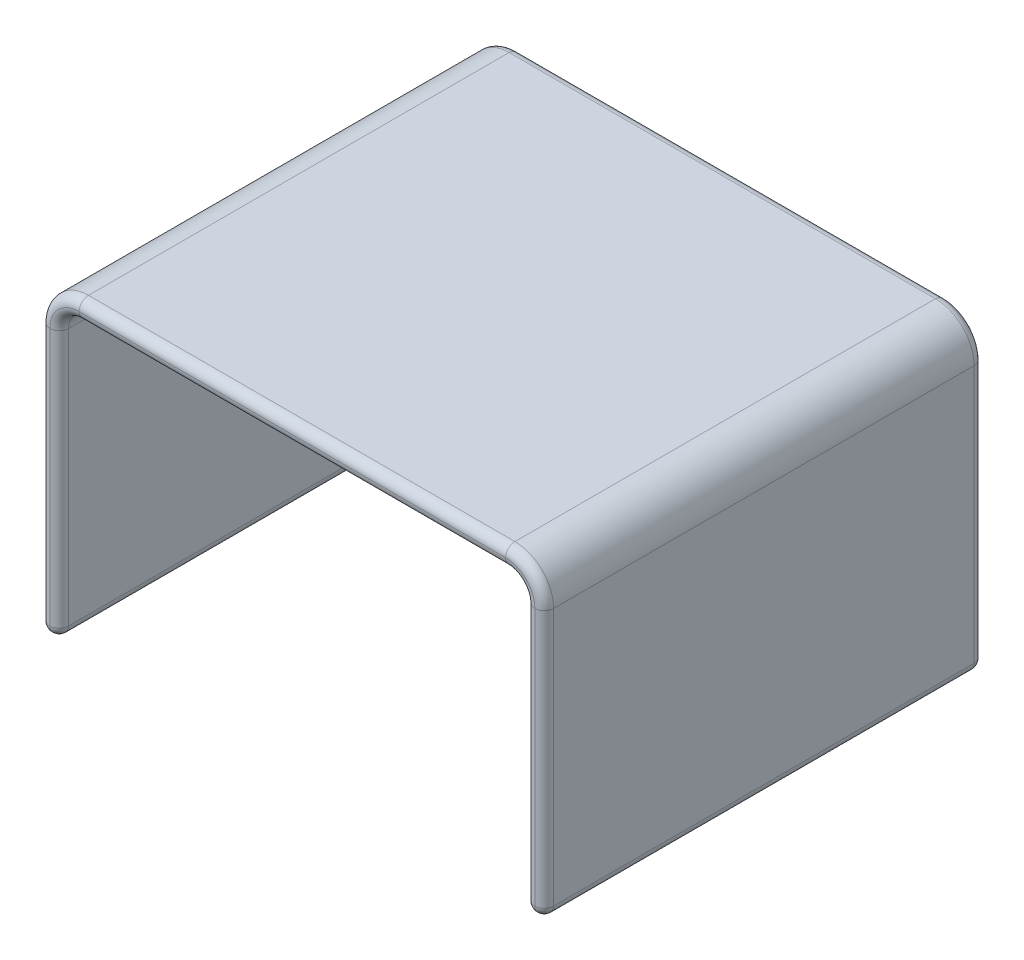
ISO-10303-21;
HEADER;
FILE_DESCRIPTION(('STEP AP214'),'2;1');
FILE_NAME('part.step','',(''),(''),'','','');
FILE_SCHEMA(('AUTOMOTIVE_DESIGN { 1 0 10303 214 1 1 1 1 }'));
ENDSEC;
DATA;
#1=APPLICATION_CONTEXT('core data for automotive mechanical design processes');
#2=APPLICATION_PROTOCOL_DEFINITION('international standard','automotive_design',2000,#1);
#3=PRODUCT_CONTEXT('',#1,'mechanical');
#4=PRODUCT('Part','Part','',(#3));
#5=PRODUCT_RELATED_PRODUCT_CATEGORY('part','',(#4));
#6=PRODUCT_DEFINITION_FORMATION('','',#4);
#7=PRODUCT_DEFINITION_CONTEXT('part definition',#1,'design');
#8=PRODUCT_DEFINITION('design','',#6,#7);
#9=PRODUCT_DEFINITION_SHAPE('','',#8);
#10=(LENGTH_UNIT() NAMED_UNIT(*) SI_UNIT(.MILLI.,.METRE.));
#11=(NAMED_UNIT(*) PLANE_ANGLE_UNIT() SI_UNIT($,.RADIAN.));
#12=(NAMED_UNIT(*) SI_UNIT($,.STERADIAN.) SOLID_ANGLE_UNIT());
#13=UNCERTAINTY_MEASURE_WITH_UNIT(LENGTH_MEASURE(1.E-05),#10,'distance_accuracy_value','');
#14=(GEOMETRIC_REPRESENTATION_CONTEXT(3) GLOBAL_UNCERTAINTY_ASSIGNED_CONTEXT((#13)) GLOBAL_UNIT_ASSIGNED_CONTEXT((#10,
#11,#12)) REPRESENTATION_CONTEXT('',''));
#15=CARTESIAN_POINT('',(0.,0.,0.));
#16=DIRECTION('',(0.,0.,1.));
#17=DIRECTION('',(1.,0.,0.));
#18=AXIS2_PLACEMENT_3D('',#15,#16,#17);
#19=CARTESIAN_POINT('',(5.461,0.,4.7625));
#20=DIRECTION('',(1.,0.,0.));
#21=DIRECTION('',(0.,0.,-1.));
#22=AXIS2_PLACEMENT_3D('',#19,#20,#21);
#23=PLANE('',#22);
#24=DIRECTION('',(0.,0.,-1.));
#25=VECTOR('',#24,1.);
#26=CARTESIAN_POINT('',(5.461,-6.223,-4.7625));
#27=LINE('',#26,#25);
#28=CARTESIAN_POINT('',(5.461,-6.223,4.5593));
#29=VERTEX_POINT('',#28);
#30=CARTESIAN_POINT('',(5.461,-6.223,-4.5593));
#31=VERTEX_POINT('',#30);
#32=EDGE_CURVE('E390',#29,#31,#27,.T.);
#33=ORIENTED_EDGE('',*,*,#32,.T.);
#34=DIRECTION('',(0.,-1.,0.));
#35=VECTOR('',#34,1.);
#36=CARTESIAN_POINT('',(5.461,-0.635,-4.5593));
#37=LINE('',#36,#35);
#38=CARTESIAN_POINT('',(5.461,-0.635,-4.5593));
#39=VERTEX_POINT('',#38);
#40=EDGE_CURVE('E393',#31,#39,#37,.F.);
#41=ORIENTED_EDGE('',*,*,#40,.T.);
#42=DIRECTION('',(0.,0.,-1.));
#43=VECTOR('',#42,1.);
#44=CARTESIAN_POINT('',(5.461,-0.635,4.7625));
#45=LINE('',#44,#43);
#46=CARTESIAN_POINT('',(5.461,-0.635,4.5593));
#47=VERTEX_POINT('',#46);
#48=EDGE_CURVE('E414',#39,#47,#45,.F.);
#49=ORIENTED_EDGE('',*,*,#48,.T.);
#50=DIRECTION('',(0.,-1.,0.));
#51=VECTOR('',#50,1.);
#52=CARTESIAN_POINT('',(5.461,0.,4.5593));
#53=LINE('',#52,#51);
#54=EDGE_CURVE('E354',#47,#29,#53,.T.);
#55=ORIENTED_EDGE('',*,*,#54,.T.);
#56=EDGE_LOOP('',(#33,#41,#49,#55));
#57=FACE_BOUND('',#56,.T.);
#58=ADVANCED_FACE('F37',(#57),#23,.T.);
#59=CARTESIAN_POINT('',(0.,0.2032,4.7625));
#60=DIRECTION('',(0.,1.,0.));
#61=DIRECTION('',(0.,0.,1.));
#62=AXIS2_PLACEMENT_3D('',#59,#60,#61);
#63=PLANE('',#62);
#64=DIRECTION('',(0.,0.,-1.));
#65=VECTOR('',#64,1.);
#66=CARTESIAN_POINT('',(4.6228,0.2032,4.7625));
#67=LINE('',#66,#65);
#68=CARTESIAN_POINT('',(4.6228,0.2032,4.5593));
#69=VERTEX_POINT('',#68);
#70=CARTESIAN_POINT('',(4.6228,0.2032,-4.5593));
#71=VERTEX_POINT('',#70);
#72=EDGE_CURVE('E200',#69,#71,#67,.T.);
#73=ORIENTED_EDGE('',*,*,#72,.T.);
#74=DIRECTION('',(1.,0.,0.));
#75=VECTOR('',#74,1.);
#76=CARTESIAN_POINT('',(-4.62279999999999,0.2032,-4.5593));
#77=LINE('',#76,#75);
#78=CARTESIAN_POINT('',(-4.62279999999999,0.2032,-4.5593));
#79=VERTEX_POINT('',#78);
#80=EDGE_CURVE('E402',#71,#79,#77,.F.);
#81=ORIENTED_EDGE('',*,*,#80,.T.);
#82=DIRECTION('',(0.,0.,-1.));
#83=VECTOR('',#82,1.);
#84=CARTESIAN_POINT('',(-4.62279999999999,0.2032,4.7625));
#85=LINE('',#84,#83);
#86=CARTESIAN_POINT('',(-4.62279999999999,0.2032,4.5593));
#87=VERTEX_POINT('',#86);
#88=EDGE_CURVE('E191',#79,#87,#85,.F.);
#89=ORIENTED_EDGE('',*,*,#88,.T.);
#90=DIRECTION('',(1.,0.,0.));
#91=VECTOR('',#90,1.);
#92=CARTESIAN_POINT('',(0.,0.2032,4.5593));
#93=LINE('',#92,#91);
#94=EDGE_CURVE('E400',#87,#69,#93,.T.);
#95=ORIENTED_EDGE('',*,*,#94,.T.);
#96=EDGE_LOOP('',(#73,#81,#89,#95));
#97=FACE_BOUND('',#96,.T.);
#98=ADVANCED_FACE('F411',(#97),#63,.T.);
#99=CARTESIAN_POINT('',(-5.46099999999999,0.,4.7625));
#100=DIRECTION('',(1.,0.,0.));
#101=DIRECTION('',(0.,0.,-1.));
#102=AXIS2_PLACEMENT_3D('',#99,#100,#101);
#103=PLANE('',#102);
#104=DIRECTION('',(0.,0.,-1.));
#105=VECTOR('',#104,1.);
#106=CARTESIAN_POINT('',(-5.46099999999999,-0.635,-4.7625));
#107=LINE('',#106,#105);
#108=CARTESIAN_POINT('',(-5.46099999999999,-0.635,4.5593));
#109=VERTEX_POINT('',#108);
#110=CARTESIAN_POINT('',(-5.46099999999999,-0.635,-4.5593));
#111=VERTEX_POINT('',#110);
#112=EDGE_CURVE('E188',#109,#111,#107,.T.);
#113=ORIENTED_EDGE('',*,*,#112,.T.);
#114=DIRECTION('',(0.,-1.,0.));
#115=VECTOR('',#114,1.);
#116=CARTESIAN_POINT('',(-5.46099999999999,0.,-4.5593));
#117=LINE('',#116,#115);
#118=CARTESIAN_POINT('',(-5.46099999999999,-6.223,-4.5593));
#119=VERTEX_POINT('',#118);
#120=EDGE_CURVE('E11',#111,#119,#117,.T.);
#121=ORIENTED_EDGE('',*,*,#120,.T.);
#122=DIRECTION('',(0.,0.,-1.));
#123=VECTOR('',#122,1.);
#124=CARTESIAN_POINT('',(-5.46099999999999,-6.223,4.7625));
#125=LINE('',#124,#123);
#126=CARTESIAN_POINT('',(-5.46099999999999,-6.223,4.5593));
#127=VERTEX_POINT('',#126);
#128=EDGE_CURVE('E55',#119,#127,#125,.F.);
#129=ORIENTED_EDGE('',*,*,#128,.T.);
#130=DIRECTION('',(0.,-1.,0.));
#131=VECTOR('',#130,1.);
#132=CARTESIAN_POINT('',(-5.46099999999999,-0.635,4.5593));
#133=LINE('',#132,#131);
#134=EDGE_CURVE('E47',#127,#109,#133,.F.);
#135=ORIENTED_EDGE('',*,*,#134,.T.);
#136=EDGE_LOOP('',(#113,#121,#129,#135));
#137=FACE_BOUND('',#136,.T.);
#138=ADVANCED_FACE('F198',(#137),#103,.F.);
#139=CARTESIAN_POINT('',(-5.05459999999999,0.,4.7625));
#140=DIRECTION('',(-1.,0.,0.));
#141=DIRECTION('',(0.,-1.,0.));
#142=AXIS2_PLACEMENT_3D('',#139,#140,#141);
#143=PLANE('',#142);
#144=DIRECTION('',(0.,0.,-1.));
#145=VECTOR('',#144,1.);
#146=CARTESIAN_POINT('',(-5.0546,-6.223,-4.7625));
#147=LINE('',#146,#145);
#148=CARTESIAN_POINT('',(-5.0546,-6.223,4.5593));
#149=VERTEX_POINT('',#148);
#150=CARTESIAN_POINT('',(-5.0546,-6.223,-4.5593));
#151=VERTEX_POINT('',#150);
#152=EDGE_CURVE('E432',#149,#151,#147,.T.);
#153=ORIENTED_EDGE('',*,*,#152,.T.);
#154=DIRECTION('',(0.,1.,0.));
#155=VECTOR('',#154,1.);
#156=CARTESIAN_POINT('',(-5.05459999999999,0.,-4.5593));
#157=LINE('',#156,#155);
#158=CARTESIAN_POINT('',(-5.05459999999999,-0.635,-4.5593));
#159=VERTEX_POINT('',#158);
#160=EDGE_CURVE('E431',#151,#159,#157,.T.);
#161=ORIENTED_EDGE('',*,*,#160,.T.);
#162=DIRECTION('',(0.,0.,-1.));
#163=VECTOR('',#162,1.);
#164=CARTESIAN_POINT('',(-5.05459999999999,-0.635,4.7625));
#165=LINE('',#164,#163);
#166=CARTESIAN_POINT('',(-5.05459999999999,-0.635,4.5593));
#167=VERTEX_POINT('',#166);
#168=EDGE_CURVE('E442',#159,#167,#165,.F.);
#169=ORIENTED_EDGE('',*,*,#168,.T.);
#170=DIRECTION('',(0.,1.,0.));
#171=VECTOR('',#170,1.);
#172=CARTESIAN_POINT('',(-5.0546,-6.4262,4.5593));
#173=LINE('',#172,#171);
#174=EDGE_CURVE('E427',#167,#149,#173,.F.);
#175=ORIENTED_EDGE('',*,*,#174,.T.);
#176=EDGE_LOOP('',(#153,#161,#169,#175));
#177=FACE_BOUND('',#176,.T.);
#178=ADVANCED_FACE('F444',(#177),#143,.F.);
#179=CARTESIAN_POINT('',(0.,-0.2032,4.7625));
#180=DIRECTION('',(0.,1.,0.));
#181=DIRECTION('',(0.,0.,1.));
#182=AXIS2_PLACEMENT_3D('',#179,#180,#181);
#183=PLANE('',#182);
#184=DIRECTION('',(0.,0.,-1.));
#185=VECTOR('',#184,1.);
#186=CARTESIAN_POINT('',(-4.62279999999999,-0.2032,-4.7625));
#187=LINE('',#186,#185);
#188=CARTESIAN_POINT('',(-4.62279999999999,-0.2032,4.5593));
#189=VERTEX_POINT('',#188);
#190=CARTESIAN_POINT('',(-4.62279999999999,-0.2032,-4.5593));
#191=VERTEX_POINT('',#190);
#192=EDGE_CURVE('E443',#189,#191,#187,.T.);
#193=ORIENTED_EDGE('',*,*,#192,.T.);
#194=DIRECTION('',(1.,0.,0.));
#195=VECTOR('',#194,1.);
#196=CARTESIAN_POINT('',(0.,-0.2032,-4.5593));
#197=LINE('',#196,#195);
#198=CARTESIAN_POINT('',(4.62280000000001,-0.2032,-4.5593));
#199=VERTEX_POINT('',#198);
#200=EDGE_CURVE('E373',#191,#199,#197,.T.);
#201=ORIENTED_EDGE('',*,*,#200,.T.);
#202=DIRECTION('',(0.,0.,-1.));
#203=VECTOR('',#202,1.);
#204=CARTESIAN_POINT('',(4.62280000000001,-0.2032,4.7625));
#205=LINE('',#204,#203);
#206=CARTESIAN_POINT('',(4.62280000000001,-0.2032,4.5593));
#207=VERTEX_POINT('',#206);
#208=EDGE_CURVE('E447',#199,#207,#205,.F.);
#209=ORIENTED_EDGE('',*,*,#208,.T.);
#210=DIRECTION('',(1.,0.,0.));
#211=VECTOR('',#210,1.);
#212=CARTESIAN_POINT('',(-4.62279999999999,-0.2032,4.5593));
#213=LINE('',#212,#211);
#214=EDGE_CURVE('E367',#207,#189,#213,.F.);
#215=ORIENTED_EDGE('',*,*,#214,.T.);
#216=EDGE_LOOP('',(#193,#201,#209,#215));
#217=FACE_BOUND('',#216,.T.);
#218=ADVANCED_FACE('F785',(#217),#183,.F.);
#219=CARTESIAN_POINT('',(5.0546,0.,4.7625));
#220=DIRECTION('',(-1.,0.,0.));
#221=DIRECTION('',(0.,0.,1.));
#222=AXIS2_PLACEMENT_3D('',#219,#220,#221);
#223=PLANE('',#222);
#224=DIRECTION('',(0.,0.,-1.));
#225=VECTOR('',#224,1.);
#226=CARTESIAN_POINT('',(5.0546,-0.635,4.7625));
#227=LINE('',#226,#225);
#228=CARTESIAN_POINT('',(5.0546,-0.635,4.5593));
#229=VERTEX_POINT('',#228);
#230=CARTESIAN_POINT('',(5.0546,-0.635,-4.5593));
#231=VERTEX_POINT('',#230);
#232=EDGE_CURVE('E436',#229,#231,#227,.T.);
#233=ORIENTED_EDGE('',*,*,#232,.T.);
#234=DIRECTION('',(0.,1.,0.));
#235=VECTOR('',#234,1.);
#236=CARTESIAN_POINT('',(5.0546,-6.4262,-4.5593));
#237=LINE('',#236,#235);
#238=CARTESIAN_POINT('',(5.0546,-6.223,-4.5593));
#239=VERTEX_POINT('',#238);
#240=EDGE_CURVE('E388',#231,#239,#237,.F.);
#241=ORIENTED_EDGE('',*,*,#240,.T.);
#242=DIRECTION('',(0.,0.,-1.));
#243=VECTOR('',#242,1.);
#244=CARTESIAN_POINT('',(5.0546,-6.223,4.7625));
#245=LINE('',#244,#243);
#246=CARTESIAN_POINT('',(5.0546,-6.223,4.5593));
#247=VERTEX_POINT('',#246);
#248=EDGE_CURVE('E385',#239,#247,#245,.F.);
#249=ORIENTED_EDGE('',*,*,#248,.T.);
#250=DIRECTION('',(0.,1.,0.));
#251=VECTOR('',#250,1.);
#252=CARTESIAN_POINT('',(5.0546,0.,4.5593));
#253=LINE('',#252,#251);
#254=EDGE_CURVE('E347',#247,#229,#253,.T.);
#255=ORIENTED_EDGE('',*,*,#254,.T.);
#256=EDGE_LOOP('',(#233,#241,#249,#255));
#257=FACE_BOUND('',#256,.T.);
#258=ADVANCED_FACE('F505',(#257),#223,.T.);
#259=CARTESIAN_POINT('',(-4.62279999999999,-0.635,4.7625));
#260=DIRECTION('',(0.,0.,1.));
#261=DIRECTION('',(1.,0.,0.));
#262=AXIS2_PLACEMENT_3D('',#259,#260,#261);
#263=CYLINDRICAL_SURFACE('',#262,0.8382);
#264=ORIENTED_EDGE('',*,*,#88,.F.);
#265=CARTESIAN_POINT('',(-4.62279999999999,-0.635,-4.5593));
#266=DIRECTION('',(0.,0.,1.));
#267=DIRECTION('',(1.,0.,0.));
#268=AXIS2_PLACEMENT_3D('',#265,#266,#267);
#269=CIRCLE('',#268,0.8382);
#270=EDGE_CURVE('E185',#79,#111,#269,.T.);
#271=ORIENTED_EDGE('',*,*,#270,.T.);
#272=ORIENTED_EDGE('',*,*,#112,.F.);
#273=CARTESIAN_POINT('',(-4.62279999999999,-0.635,4.5593));
#274=DIRECTION('',(0.,0.,1.));
#275=DIRECTION('',(1.,0.,0.));
#276=AXIS2_PLACEMENT_3D('',#273,#274,#275);
#277=CIRCLE('',#276,0.8382);
#278=EDGE_CURVE('E196',#109,#87,#277,.F.);
#279=ORIENTED_EDGE('',*,*,#278,.T.);
#280=EDGE_LOOP('',(#264,#271,#272,#279));
#281=FACE_BOUND('',#280,.T.);
#282=ADVANCED_FACE('F187',(#281),#263,.T.);
#283=CARTESIAN_POINT('',(4.6228,-0.635,4.7625));
#284=DIRECTION('',(0.,0.,-1.));
#285=DIRECTION('',(-1.,0.,0.));
#286=AXIS2_PLACEMENT_3D('',#283,#284,#285);
#287=CYLINDRICAL_SURFACE('',#286,0.8382);
#288=ORIENTED_EDGE('',*,*,#48,.F.);
#289=CARTESIAN_POINT('',(4.6228,-0.635,-4.5593));
#290=DIRECTION('',(0.,0.,1.));
#291=DIRECTION('',(1.,0.,0.));
#292=AXIS2_PLACEMENT_3D('',#289,#290,#291);
#293=CIRCLE('',#292,0.8382);
#294=EDGE_CURVE('E398',#39,#71,#293,.T.);
#295=ORIENTED_EDGE('',*,*,#294,.T.);
#296=ORIENTED_EDGE('',*,*,#72,.F.);
#297=CARTESIAN_POINT('',(4.6228,-0.635,4.5593));
#298=DIRECTION('',(0.,0.,1.));
#299=DIRECTION('',(1.,0.,0.));
#300=AXIS2_PLACEMENT_3D('',#297,#298,#299);
#301=CIRCLE('',#300,0.8382);
#302=EDGE_CURVE('E396',#69,#47,#301,.F.);
#303=ORIENTED_EDGE('',*,*,#302,.T.);
#304=EDGE_LOOP('',(#288,#295,#296,#303));
#305=FACE_BOUND('',#304,.T.);
#306=ADVANCED_FACE('F504',(#305),#287,.T.);
#307=CARTESIAN_POINT('',(-4.62279999999999,-0.635,4.7625));
#308=DIRECTION('',(0.,0.,1.));
#309=DIRECTION('',(1.,0.,0.));
#310=AXIS2_PLACEMENT_3D('',#307,#308,#309);
#311=CYLINDRICAL_SURFACE('',#310,0.4318);
#312=ORIENTED_EDGE('',*,*,#168,.F.);
#313=CARTESIAN_POINT('',(-4.62279999999999,-0.635,-4.5593));
#314=DIRECTION('',(0.,0.,1.));
#315=DIRECTION('',(1.,0.,0.));
#316=AXIS2_PLACEMENT_3D('',#313,#314,#315);
#317=CIRCLE('',#316,0.4318);
#318=EDGE_CURVE('E374',#159,#191,#317,.F.);
#319=ORIENTED_EDGE('',*,*,#318,.T.);
#320=ORIENTED_EDGE('',*,*,#192,.F.);
#321=CARTESIAN_POINT('',(-4.62279999999999,-0.635,4.5593));
#322=DIRECTION('',(0.,0.,1.));
#323=DIRECTION('',(1.,0.,0.));
#324=AXIS2_PLACEMENT_3D('',#321,#322,#323);
#325=CIRCLE('',#324,0.4318);
#326=EDGE_CURVE('E378',#189,#167,#325,.T.);
#327=ORIENTED_EDGE('',*,*,#326,.T.);
#328=EDGE_LOOP('',(#312,#319,#320,#327));
#329=FACE_BOUND('',#328,.T.);
#330=ADVANCED_FACE('F441',(#329),#311,.F.);
#331=CARTESIAN_POINT('',(4.62280000000001,-0.635,4.7625));
#332=DIRECTION('',(0.,0.,-1.));
#333=DIRECTION('',(-1.,0.,0.));
#334=AXIS2_PLACEMENT_3D('',#331,#332,#333);
#335=CYLINDRICAL_SURFACE('',#334,0.4318);
#336=ORIENTED_EDGE('',*,*,#208,.F.);
#337=CARTESIAN_POINT('',(4.62280000000001,-0.635,-4.5593));
#338=DIRECTION('',(0.,0.,1.));
#339=DIRECTION('',(1.,0.,0.));
#340=AXIS2_PLACEMENT_3D('',#337,#338,#339);
#341=CIRCLE('',#340,0.4318);
#342=EDGE_CURVE('E383',#199,#231,#341,.F.);
#343=ORIENTED_EDGE('',*,*,#342,.T.);
#344=ORIENTED_EDGE('',*,*,#232,.F.);
#345=CARTESIAN_POINT('',(4.62280000000001,-0.635,4.5593));
#346=DIRECTION('',(0.,0.,1.));
#347=DIRECTION('',(1.,0.,0.));
#348=AXIS2_PLACEMENT_3D('',#345,#346,#347);
#349=CIRCLE('',#348,0.4318);
#350=EDGE_CURVE('E376',#229,#207,#349,.T.);
#351=ORIENTED_EDGE('',*,*,#350,.T.);
#352=EDGE_LOOP('',(#336,#343,#344,#351));
#353=FACE_BOUND('',#352,.T.);
#354=ADVANCED_FACE('F510',(#353),#335,.F.);
#355=CARTESIAN_POINT('',(5.2578,-6.223,4.5593));
#356=DIRECTION('',(0.,0.,1.));
#357=DIRECTION('',(1.,0.,0.));
#358=AXIS2_PLACEMENT_3D('',#355,#356,#357);
#359=SPHERICAL_SURFACE('',#358,0.2032);
#360=CARTESIAN_POINT('',(5.2578,-6.223,4.5593));
#361=DIRECTION('',(0.,0.,1.));
#362=DIRECTION('',(1.,0.,0.));
#363=AXIS2_PLACEMENT_3D('',#360,#361,#362);
#364=CIRCLE('',#363,0.2032);
#365=CARTESIAN_POINT('',(5.2578,-6.4262,4.5593));
#366=VERTEX_POINT('',#365);
#367=EDGE_CURVE('E340',#366,#247,#364,.F.);
#368=ORIENTED_EDGE('',*,*,#367,.F.);
#369=CARTESIAN_POINT('',(5.2578,-6.223,4.5593));
#370=DIRECTION('',(1.,0.,0.));
#371=DIRECTION('',(0.,0.,-1.));
#372=AXIS2_PLACEMENT_3D('',#369,#370,#371);
#373=CIRCLE('',#372,0.2032);
#374=CARTESIAN_POINT('',(5.2578,-6.223,4.7625));
#375=VERTEX_POINT('',#374);
#376=EDGE_CURVE('E41',#375,#366,#373,.T.);
#377=ORIENTED_EDGE('',*,*,#376,.F.);
#378=CARTESIAN_POINT('',(5.2578,-6.223,4.5593));
#379=DIRECTION('',(0.,-1.,0.));
#380=DIRECTION('',(0.,0.,-1.));
#381=AXIS2_PLACEMENT_3D('',#378,#379,#380);
#382=CIRCLE('',#381,0.2032);
#383=EDGE_CURVE('E342',#247,#375,#382,.F.);
#384=ORIENTED_EDGE('',*,*,#383,.F.);
#385=EDGE_LOOP('',(#368,#377,#384));
#386=FACE_BOUND('',#385,.T.);
#387=ADVANCED_FACE('F39',(#386),#359,.T.);
#388=CARTESIAN_POINT('',(5.2578,-6.223,4.5593));
#389=DIRECTION('',(0.,0.,1.));
#390=DIRECTION('',(1.,0.,0.));
#391=AXIS2_PLACEMENT_3D('',#388,#389,#390);
#392=SPHERICAL_SURFACE('',#391,0.2032);
#393=CARTESIAN_POINT('',(5.2578,-6.223,4.5593));
#394=DIRECTION('',(0.,-1.,0.));
#395=DIRECTION('',(0.,0.,-1.));
#396=AXIS2_PLACEMENT_3D('',#393,#394,#395);
#397=CIRCLE('',#396,0.2032);
#398=EDGE_CURVE('E331',#375,#29,#397,.F.);
#399=ORIENTED_EDGE('',*,*,#398,.F.);
#400=ORIENTED_EDGE('',*,*,#376,.T.);
#401=CARTESIAN_POINT('',(5.2578,-6.223,4.5593));
#402=DIRECTION('',(0.,0.,1.));
#403=DIRECTION('',(1.,0.,0.));
#404=AXIS2_PLACEMENT_3D('',#401,#402,#403);
#405=CIRCLE('',#404,0.2032);
#406=EDGE_CURVE('E334',#29,#366,#405,.F.);
#407=ORIENTED_EDGE('',*,*,#406,.F.);
#408=EDGE_LOOP('',(#399,#400,#407));
#409=FACE_BOUND('',#408,.T.);
#410=ADVANCED_FACE('F348',(#409),#392,.T.);
#411=CARTESIAN_POINT('',(5.2578,0.,4.5593));
#412=DIRECTION('',(0.,1.,0.));
#413=DIRECTION('',(0.,0.,1.));
#414=AXIS2_PLACEMENT_3D('',#411,#412,#413);
#415=CYLINDRICAL_SURFACE('',#414,0.2032);
#416=ORIENTED_EDGE('',*,*,#254,.F.);
#417=ORIENTED_EDGE('',*,*,#383,.T.);
#418=DIRECTION('',(0.,1.,0.));
#419=VECTOR('',#418,1.);
#420=CARTESIAN_POINT('',(5.2578,0.,4.7625));
#421=LINE('',#420,#419);
#422=CARTESIAN_POINT('',(5.2578,-0.635,4.7625));
#423=VERTEX_POINT('',#422);
#424=EDGE_CURVE('E328',#423,#375,#421,.F.);
#425=ORIENTED_EDGE('',*,*,#424,.F.);
#426=CARTESIAN_POINT('',(5.2578,-0.635,4.5593));
#427=DIRECTION('',(0.,1.,0.));
#428=DIRECTION('',(0.,0.,1.));
#429=AXIS2_PLACEMENT_3D('',#426,#427,#428);
#430=CIRCLE('',#429,0.2032);
#431=EDGE_CURVE('E325',#229,#423,#430,.T.);
#432=ORIENTED_EDGE('',*,*,#431,.F.);
#433=EDGE_LOOP('',(#416,#417,#425,#432));
#434=FACE_BOUND('',#433,.T.);
#435=ADVANCED_FACE('F345',(#434),#415,.T.);
#436=CARTESIAN_POINT('',(5.2578,-6.223,4.7625));
#437=DIRECTION('',(0.,0.,1.));
#438=DIRECTION('',(1.,0.,0.));
#439=AXIS2_PLACEMENT_3D('',#436,#437,#438);
#440=CYLINDRICAL_SURFACE('',#439,0.2032);
#441=CARTESIAN_POINT('',(5.2578,-6.223,-4.5593));
#442=DIRECTION('',(0.,0.,-1.));
#443=DIRECTION('',(-1.,0.,0.));
#444=AXIS2_PLACEMENT_3D('',#441,#442,#443);
#445=CIRCLE('',#444,0.2032);
#446=CARTESIAN_POINT('',(5.2578,-6.4262,-4.5593));
#447=VERTEX_POINT('',#446);
#448=EDGE_CURVE('E322',#447,#239,#445,.T.);
#449=ORIENTED_EDGE('',*,*,#448,.F.);
#450=DIRECTION('',(0.,0.,-1.));
#451=VECTOR('',#450,1.);
#452=CARTESIAN_POINT('',(5.2578,-6.4262,-4.7625));
#453=LINE('',#452,#451);
#454=EDGE_CURVE('E337',#366,#447,#453,.T.);
#455=ORIENTED_EDGE('',*,*,#454,.F.);
#456=ORIENTED_EDGE('',*,*,#367,.T.);
#457=ORIENTED_EDGE('',*,*,#248,.F.);
#458=EDGE_LOOP('',(#449,#455,#456,#457));
#459=FACE_BOUND('',#458,.T.);
#460=ADVANCED_FACE('F729',(#459),#440,.T.);
#461=CARTESIAN_POINT('',(5.2578,-6.223,4.7625));
#462=DIRECTION('',(0.,0.,1.));
#463=DIRECTION('',(1.,0.,0.));
#464=AXIS2_PLACEMENT_3D('',#461,#462,#463);
#465=CYLINDRICAL_SURFACE('',#464,0.2032);
#466=ORIENTED_EDGE('',*,*,#406,.T.);
#467=ORIENTED_EDGE('',*,*,#454,.T.);
#468=CARTESIAN_POINT('',(5.2578,-6.223,-4.5593));
#469=DIRECTION('',(0.,0.,-1.));
#470=DIRECTION('',(0.,1.,0.));
#471=AXIS2_PLACEMENT_3D('',#468,#469,#470);
#472=CIRCLE('',#471,0.2032);
#473=EDGE_CURVE('E317',#31,#447,#472,.T.);
#474=ORIENTED_EDGE('',*,*,#473,.F.);
#475=ORIENTED_EDGE('',*,*,#32,.F.);
#476=EDGE_LOOP('',(#466,#467,#474,#475));
#477=FACE_BOUND('',#476,.T.);
#478=ADVANCED_FACE('F721',(#477),#465,.T.);
#479=CARTESIAN_POINT('',(5.2578,0.,4.5593));
#480=DIRECTION('',(0.,-1.,0.));
#481=DIRECTION('',(0.,0.,-1.));
#482=AXIS2_PLACEMENT_3D('',#479,#480,#481);
#483=CYLINDRICAL_SURFACE('',#482,0.2032);
#484=ORIENTED_EDGE('',*,*,#398,.T.);
#485=ORIENTED_EDGE('',*,*,#54,.F.);
#486=CARTESIAN_POINT('',(5.2578,-0.635,4.5593));
#487=DIRECTION('',(0.,1.,0.));
#488=DIRECTION('',(0.,0.,1.));
#489=AXIS2_PLACEMENT_3D('',#486,#487,#488);
#490=CIRCLE('',#489,0.2032);
#491=EDGE_CURVE('E314',#423,#47,#490,.T.);
#492=ORIENTED_EDGE('',*,*,#491,.F.);
#493=ORIENTED_EDGE('',*,*,#424,.T.);
#494=EDGE_LOOP('',(#484,#485,#492,#493));
#495=FACE_BOUND('',#494,.T.);
#496=ADVANCED_FACE('F353',(#495),#483,.T.);
#497=CARTESIAN_POINT('',(4.62280000000001,-0.635,4.5593));
#498=DIRECTION('',(0.,0.,1.));
#499=DIRECTION('',(1.,0.,0.));
#500=AXIS2_PLACEMENT_3D('',#497,#498,#499);
#501=TOROIDAL_SURFACE('',#500,0.635,0.2032);
#502=ORIENTED_EDGE('',*,*,#350,.F.);
#503=ORIENTED_EDGE('',*,*,#431,.T.);
#504=CARTESIAN_POINT('',(4.62280000000001,-0.635,4.7625));
#505=DIRECTION('',(0.,0.,1.));
#506=DIRECTION('',(1.,0.,0.));
#507=AXIS2_PLACEMENT_3D('',#504,#505,#506);
#508=CIRCLE('',#507,0.635);
#509=CARTESIAN_POINT('',(4.6228,0.,4.7625));
#510=VERTEX_POINT('',#509);
#511=EDGE_CURVE('E311',#510,#423,#508,.F.);
#512=ORIENTED_EDGE('',*,*,#511,.F.);
#513=CARTESIAN_POINT('',(4.62280000000001,0.,4.5593));
#514=DIRECTION('',(-1.,0.,0.));
#515=DIRECTION('',(0.,0.,1.));
#516=AXIS2_PLACEMENT_3D('',#513,#514,#515);
#517=CIRCLE('',#516,0.2032);
#518=EDGE_CURVE('E308',#207,#510,#517,.T.);
#519=ORIENTED_EDGE('',*,*,#518,.F.);
#520=EDGE_LOOP('',(#502,#503,#512,#519));
#521=FACE_BOUND('',#520,.T.);
#522=ADVANCED_FACE('F362',(#521),#501,.T.);
#523=CARTESIAN_POINT('',(5.2578,-6.223,-4.5593));
#524=DIRECTION('',(0.,0.,1.));
#525=DIRECTION('',(1.,0.,0.));
#526=AXIS2_PLACEMENT_3D('',#523,#524,#525);
#527=SPHERICAL_SURFACE('',#526,0.2032);
#528=CARTESIAN_POINT('',(5.2578,-6.223,-4.5593));
#529=DIRECTION('',(-1.,0.,0.));
#530=DIRECTION('',(0.,-1.,0.));
#531=AXIS2_PLACEMENT_3D('',#528,#529,#530);
#532=CIRCLE('',#531,0.2032);
#533=CARTESIAN_POINT('',(5.2578,-6.223,-4.7625));
#534=VERTEX_POINT('',#533);
#535=EDGE_CURVE('E320',#534,#447,#532,.T.);
#536=ORIENTED_EDGE('',*,*,#535,.T.);
#537=ORIENTED_EDGE('',*,*,#448,.T.);
#538=CARTESIAN_POINT('',(5.2578,-6.223,-4.5593));
#539=DIRECTION('',(0.,-1.,0.));
#540=DIRECTION('',(0.,0.,-1.));
#541=AXIS2_PLACEMENT_3D('',#538,#539,#540);
#542=CIRCLE('',#541,0.2032);
#543=EDGE_CURVE('E305',#534,#239,#542,.F.);
#544=ORIENTED_EDGE('',*,*,#543,.F.);
#545=EDGE_LOOP('',(#536,#537,#544));
#546=FACE_BOUND('',#545,.T.);
#547=ADVANCED_FACE('F696',(#546),#527,.T.);
#548=CARTESIAN_POINT('',(5.2578,-6.223,-4.5593));
#549=DIRECTION('',(0.,0.,1.));
#550=DIRECTION('',(1.,0.,0.));
#551=AXIS2_PLACEMENT_3D('',#548,#549,#550);
#552=SPHERICAL_SURFACE('',#551,0.2032);
#553=ORIENTED_EDGE('',*,*,#473,.T.);
#554=ORIENTED_EDGE('',*,*,#535,.F.);
#555=CARTESIAN_POINT('',(5.2578,-6.223,-4.5593));
#556=DIRECTION('',(0.,-1.,0.));
#557=DIRECTION('',(0.,0.,-1.));
#558=AXIS2_PLACEMENT_3D('',#555,#556,#557);
#559=CIRCLE('',#558,0.2032);
#560=EDGE_CURVE('E300',#31,#534,#559,.F.);
#561=ORIENTED_EDGE('',*,*,#560,.F.);
#562=EDGE_LOOP('',(#553,#554,#561));
#563=FACE_BOUND('',#562,.T.);
#564=ADVANCED_FACE('F688',(#563),#552,.T.);
#565=CARTESIAN_POINT('',(4.6228,-0.635,4.5593));
#566=DIRECTION('',(0.,0.,1.));
#567=DIRECTION('',(1.,0.,0.));
#568=AXIS2_PLACEMENT_3D('',#565,#566,#567);
#569=TOROIDAL_SURFACE('',#568,0.635,0.2032);
#570=ORIENTED_EDGE('',*,*,#491,.T.);
#571=ORIENTED_EDGE('',*,*,#302,.F.);
#572=CARTESIAN_POINT('',(4.6228,0.,4.5593));
#573=DIRECTION('',(-1.,0.,0.));
#574=DIRECTION('',(0.,0.,1.));
#575=AXIS2_PLACEMENT_3D('',#572,#573,#574);
#576=CIRCLE('',#575,0.2032);
#577=EDGE_CURVE('E297',#510,#69,#576,.T.);
#578=ORIENTED_EDGE('',*,*,#577,.F.);
#579=ORIENTED_EDGE('',*,*,#511,.T.);
#580=EDGE_LOOP('',(#570,#571,#578,#579));
#581=FACE_BOUND('',#580,.T.);
#582=ADVANCED_FACE('F358',(#581),#569,.T.);
#583=CARTESIAN_POINT('',(0.,0.,4.5593));
#584=DIRECTION('',(-1.,0.,0.));
#585=DIRECTION('',(0.,0.,1.));
#586=AXIS2_PLACEMENT_3D('',#583,#584,#585);
#587=CYLINDRICAL_SURFACE('',#586,0.2032);
#588=ORIENTED_EDGE('',*,*,#214,.F.);
#589=ORIENTED_EDGE('',*,*,#518,.T.);
#590=DIRECTION('',(1.,0.,0.));
#591=VECTOR('',#590,1.);
#592=CARTESIAN_POINT('',(4.62280000000001,0.,4.7625));
#593=LINE('',#592,#591);
#594=CARTESIAN_POINT('',(-4.62279999999999,0.,4.7625));
#595=VERTEX_POINT('',#594);
#596=EDGE_CURVE('E294',#595,#510,#593,.T.);
#597=ORIENTED_EDGE('',*,*,#596,.F.);
#598=CARTESIAN_POINT('',(-4.62279999999999,0.,4.5593));
#599=DIRECTION('',(-1.,0.,0.));
#600=DIRECTION('',(0.,0.,1.));
#601=AXIS2_PLACEMENT_3D('',#598,#599,#600);
#602=CIRCLE('',#601,0.2032);
#603=EDGE_CURVE('E291',#189,#595,#602,.T.);
#604=ORIENTED_EDGE('',*,*,#603,.F.);
#605=EDGE_LOOP('',(#588,#589,#597,#604));
#606=FACE_BOUND('',#605,.T.);
#607=ADVANCED_FACE('F365',(#606),#587,.T.);
#608=CARTESIAN_POINT('',(5.2578,0.,-4.5593));
#609=DIRECTION('',(0.,-1.,0.));
#610=DIRECTION('',(0.,0.,-1.));
#611=AXIS2_PLACEMENT_3D('',#608,#609,#610);
#612=CYLINDRICAL_SURFACE('',#611,0.2032);
#613=DIRECTION('',(0.,1.,0.));
#614=VECTOR('',#613,1.);
#615=CARTESIAN_POINT('',(5.2578,-0.635,-4.7625));
#616=LINE('',#615,#614);
#617=CARTESIAN_POINT('',(5.2578,-0.635,-4.7625));
#618=VERTEX_POINT('',#617);
#619=EDGE_CURVE('E303',#534,#618,#616,.T.);
#620=ORIENTED_EDGE('',*,*,#619,.F.);
#621=ORIENTED_EDGE('',*,*,#543,.T.);
#622=ORIENTED_EDGE('',*,*,#240,.F.);
#623=CARTESIAN_POINT('',(5.2578,-0.635,-4.5593));
#624=DIRECTION('',(0.,1.,0.));
#625=DIRECTION('',(0.,0.,1.));
#626=AXIS2_PLACEMENT_3D('',#623,#624,#625);
#627=CIRCLE('',#626,0.2032);
#628=EDGE_CURVE('E288',#618,#231,#627,.T.);
#629=ORIENTED_EDGE('',*,*,#628,.F.);
#630=EDGE_LOOP('',(#620,#621,#622,#629));
#631=FACE_BOUND('',#630,.T.);
#632=ADVANCED_FACE('F664',(#631),#612,.T.);
#633=CARTESIAN_POINT('',(5.2578,0.,-4.5593));
#634=DIRECTION('',(0.,1.,0.));
#635=DIRECTION('',(0.,0.,1.));
#636=AXIS2_PLACEMENT_3D('',#633,#634,#635);
#637=CYLINDRICAL_SURFACE('',#636,0.2032);
#638=ORIENTED_EDGE('',*,*,#560,.T.);
#639=ORIENTED_EDGE('',*,*,#619,.T.);
#640=CARTESIAN_POINT('',(5.2578,-0.635,-4.5593));
#641=DIRECTION('',(0.,1.,0.));
#642=DIRECTION('',(0.,0.,1.));
#643=AXIS2_PLACEMENT_3D('',#640,#641,#642);
#644=CIRCLE('',#643,0.2032);
#645=EDGE_CURVE('E283',#39,#618,#644,.T.);
#646=ORIENTED_EDGE('',*,*,#645,.F.);
#647=ORIENTED_EDGE('',*,*,#40,.F.);
#648=EDGE_LOOP('',(#638,#639,#646,#647));
#649=FACE_BOUND('',#648,.T.);
#650=ADVANCED_FACE('F656',(#649),#637,.T.);
#651=CARTESIAN_POINT('',(0.,0.,4.5593));
#652=DIRECTION('',(1.,0.,0.));
#653=DIRECTION('',(0.,0.,-1.));
#654=AXIS2_PLACEMENT_3D('',#651,#652,#653);
#655=CYLINDRICAL_SURFACE('',#654,0.2032);
#656=ORIENTED_EDGE('',*,*,#577,.T.);
#657=ORIENTED_EDGE('',*,*,#94,.F.);
#658=CARTESIAN_POINT('',(-4.62279999999999,0.,4.5593));
#659=DIRECTION('',(-1.,0.,0.));
#660=DIRECTION('',(0.,0.,1.));
#661=AXIS2_PLACEMENT_3D('',#658,#659,#660);
#662=CIRCLE('',#661,0.2032);
#663=EDGE_CURVE('E280',#595,#87,#662,.T.);
#664=ORIENTED_EDGE('',*,*,#663,.F.);
#665=ORIENTED_EDGE('',*,*,#596,.T.);
#666=EDGE_LOOP('',(#656,#657,#664,#665));
#667=FACE_BOUND('',#666,.T.);
#668=ADVANCED_FACE('F418',(#667),#655,.T.);
#669=CARTESIAN_POINT('',(-4.62279999999999,-0.635,4.5593));
#670=DIRECTION('',(0.,0.,1.));
#671=DIRECTION('',(1.,0.,0.));
#672=AXIS2_PLACEMENT_3D('',#669,#670,#671);
#673=TOROIDAL_SURFACE('',#672,0.635,0.2032);
#674=ORIENTED_EDGE('',*,*,#326,.F.);
#675=ORIENTED_EDGE('',*,*,#603,.T.);
#676=CARTESIAN_POINT('',(-4.62279999999999,-0.635,4.7625));
#677=DIRECTION('',(0.,0.,1.));
#678=DIRECTION('',(1.,0.,0.));
#679=AXIS2_PLACEMENT_3D('',#676,#677,#678);
#680=CIRCLE('',#679,0.635);
#681=CARTESIAN_POINT('',(-5.25779999999999,-0.635,4.7625));
#682=VERTEX_POINT('',#681);
#683=EDGE_CURVE('E277',#682,#595,#680,.F.);
#684=ORIENTED_EDGE('',*,*,#683,.F.);
#685=CARTESIAN_POINT('',(-5.25779999999999,-0.635,4.5593));
#686=DIRECTION('',(0.,-1.,0.));
#687=DIRECTION('',(0.,0.,-1.));
#688=AXIS2_PLACEMENT_3D('',#685,#686,#687);
#689=CIRCLE('',#688,0.2032);
#690=EDGE_CURVE('E274',#167,#682,#689,.T.);
#691=ORIENTED_EDGE('',*,*,#690,.F.);
#692=EDGE_LOOP('',(#674,#675,#684,#691));
#693=FACE_BOUND('',#692,.T.);
#694=ADVANCED_FACE('F422',(#693),#673,.T.);
#695=CARTESIAN_POINT('',(4.62280000000001,-0.635,-4.5593));
#696=DIRECTION('',(0.,0.,1.));
#697=DIRECTION('',(1.,0.,0.));
#698=AXIS2_PLACEMENT_3D('',#695,#696,#697);
#699=TOROIDAL_SURFACE('',#698,0.635,0.2032);
#700=CARTESIAN_POINT('',(4.62280000000001,-0.635,-4.7625));
#701=DIRECTION('',(0.,0.,1.));
#702=DIRECTION('',(1.,0.,0.));
#703=AXIS2_PLACEMENT_3D('',#700,#701,#702);
#704=CIRCLE('',#703,0.635);
#705=CARTESIAN_POINT('',(4.6228,0.,-4.7625));
#706=VERTEX_POINT('',#705);
#707=EDGE_CURVE('E286',#618,#706,#704,.T.);
#708=ORIENTED_EDGE('',*,*,#707,.F.);
#709=ORIENTED_EDGE('',*,*,#628,.T.);
#710=ORIENTED_EDGE('',*,*,#342,.F.);
#711=CARTESIAN_POINT('',(4.62280000000001,0.,-4.5593));
#712=DIRECTION('',(-1.,0.,0.));
#713=DIRECTION('',(0.,0.,1.));
#714=AXIS2_PLACEMENT_3D('',#711,#712,#713);
#715=CIRCLE('',#714,0.2032);
#716=EDGE_CURVE('E271',#706,#199,#715,.T.);
#717=ORIENTED_EDGE('',*,*,#716,.F.);
#718=EDGE_LOOP('',(#708,#709,#710,#717));
#719=FACE_BOUND('',#718,.T.);
#720=ADVANCED_FACE('F629',(#719),#699,.T.);
#721=CARTESIAN_POINT('',(4.6228,-0.635,-4.5593));
#722=DIRECTION('',(0.,0.,1.));
#723=DIRECTION('',(1.,0.,0.));
#724=AXIS2_PLACEMENT_3D('',#721,#722,#723);
#725=TOROIDAL_SURFACE('',#724,0.635,0.2032);
#726=ORIENTED_EDGE('',*,*,#645,.T.);
#727=ORIENTED_EDGE('',*,*,#707,.T.);
#728=CARTESIAN_POINT('',(4.6228,0.,-4.5593));
#729=DIRECTION('',(-1.,0.,0.));
#730=DIRECTION('',(0.,0.,1.));
#731=AXIS2_PLACEMENT_3D('',#728,#729,#730);
#732=CIRCLE('',#731,0.2032);
#733=EDGE_CURVE('E266',#71,#706,#732,.T.);
#734=ORIENTED_EDGE('',*,*,#733,.F.);
#735=ORIENTED_EDGE('',*,*,#294,.F.);
#736=EDGE_LOOP('',(#726,#727,#734,#735));
#737=FACE_BOUND('',#736,.T.);
#738=ADVANCED_FACE('F456',(#737),#725,.T.);
#739=CARTESIAN_POINT('',(-4.62279999999999,-0.635,4.5593));
#740=DIRECTION('',(0.,0.,1.));
#741=DIRECTION('',(1.,0.,0.));
#742=AXIS2_PLACEMENT_3D('',#739,#740,#741);
#743=TOROIDAL_SURFACE('',#742,0.635,0.2032);
#744=ORIENTED_EDGE('',*,*,#663,.T.);
#745=ORIENTED_EDGE('',*,*,#278,.F.);
#746=CARTESIAN_POINT('',(-5.25779999999999,-0.635,4.5593));
#747=DIRECTION('',(0.,-1.,0.));
#748=DIRECTION('',(0.,0.,-1.));
#749=AXIS2_PLACEMENT_3D('',#746,#747,#748);
#750=CIRCLE('',#749,0.2032);
#751=EDGE_CURVE('E263',#682,#109,#750,.T.);
#752=ORIENTED_EDGE('',*,*,#751,.F.);
#753=ORIENTED_EDGE('',*,*,#683,.T.);
#754=EDGE_LOOP('',(#744,#745,#752,#753));
#755=FACE_BOUND('',#754,.T.);
#756=ADVANCED_FACE('F419',(#755),#743,.T.);
#757=CARTESIAN_POINT('',(-5.25779999999999,0.,4.5593));
#758=DIRECTION('',(0.,-1.,0.));
#759=DIRECTION('',(1.,0.,0.));
#760=AXIS2_PLACEMENT_3D('',#757,#758,#759);
#761=CYLINDRICAL_SURFACE('',#760,0.2032);
#762=ORIENTED_EDGE('',*,*,#174,.F.);
#763=ORIENTED_EDGE('',*,*,#690,.T.);
#764=DIRECTION('',(0.,1.,0.));
#765=VECTOR('',#764,1.);
#766=CARTESIAN_POINT('',(-5.25779999999999,-0.635,4.7625));
#767=LINE('',#766,#765);
#768=CARTESIAN_POINT('',(-5.2578,-6.223,4.7625));
#769=VERTEX_POINT('',#768);
#770=EDGE_CURVE('E260',#769,#682,#767,.T.);
#771=ORIENTED_EDGE('',*,*,#770,.F.);
#772=CARTESIAN_POINT('',(-5.2578,-6.223,4.5593));
#773=DIRECTION('',(0.,-1.,0.));
#774=DIRECTION('',(0.,0.,-1.));
#775=AXIS2_PLACEMENT_3D('',#772,#773,#774);
#776=CIRCLE('',#775,0.2032);
#777=EDGE_CURVE('E257',#149,#769,#776,.T.);
#778=ORIENTED_EDGE('',*,*,#777,.F.);
#779=EDGE_LOOP('',(#762,#763,#771,#778));
#780=FACE_BOUND('',#779,.T.);
#781=ADVANCED_FACE('F425',(#780),#761,.T.);
#782=CARTESIAN_POINT('',(0.,0.,-4.5593));
#783=DIRECTION('',(1.,0.,0.));
#784=DIRECTION('',(0.,0.,-1.));
#785=AXIS2_PLACEMENT_3D('',#782,#783,#784);
#786=CYLINDRICAL_SURFACE('',#785,0.2032);
#787=DIRECTION('',(1.,0.,0.));
#788=VECTOR('',#787,1.);
#789=CARTESIAN_POINT('',(0.,0.,-4.7625));
#790=LINE('',#789,#788);
#791=CARTESIAN_POINT('',(-4.62279999999999,0.,-4.7625));
#792=VERTEX_POINT('',#791);
#793=EDGE_CURVE('E269',#706,#792,#790,.F.);
#794=ORIENTED_EDGE('',*,*,#793,.F.);
#795=ORIENTED_EDGE('',*,*,#716,.T.);
#796=ORIENTED_EDGE('',*,*,#200,.F.);
#797=CARTESIAN_POINT('',(-4.62279999999999,0.,-4.5593));
#798=DIRECTION('',(-1.,0.,0.));
#799=DIRECTION('',(0.,0.,1.));
#800=AXIS2_PLACEMENT_3D('',#797,#798,#799);
#801=CIRCLE('',#800,0.2032);
#802=EDGE_CURVE('E254',#792,#191,#801,.T.);
#803=ORIENTED_EDGE('',*,*,#802,.F.);
#804=EDGE_LOOP('',(#794,#795,#796,#803));
#805=FACE_BOUND('',#804,.T.);
#806=ADVANCED_FACE('F466',(#805),#786,.T.);
#807=CARTESIAN_POINT('',(0.,0.,-4.5593));
#808=DIRECTION('',(-1.,0.,0.));
#809=DIRECTION('',(0.,0.,1.));
#810=AXIS2_PLACEMENT_3D('',#807,#808,#809);
#811=CYLINDRICAL_SURFACE('',#810,0.2032);
#812=ORIENTED_EDGE('',*,*,#733,.T.);
#813=ORIENTED_EDGE('',*,*,#793,.T.);
#814=CARTESIAN_POINT('',(-4.62279999999999,0.,-4.5593));
#815=DIRECTION('',(-1.,0.,0.));
#816=DIRECTION('',(0.,0.,1.));
#817=AXIS2_PLACEMENT_3D('',#814,#815,#816);
#818=CIRCLE('',#817,0.2032);
#819=EDGE_CURVE('E251',#79,#792,#818,.T.);
#820=ORIENTED_EDGE('',*,*,#819,.F.);
#821=ORIENTED_EDGE('',*,*,#80,.F.);
#822=EDGE_LOOP('',(#812,#813,#820,#821));
#823=FACE_BOUND('',#822,.T.);
#824=ADVANCED_FACE('F461',(#823),#811,.T.);
#825=CARTESIAN_POINT('',(-5.25779999999999,0.,4.5593));
#826=DIRECTION('',(0.,1.,0.));
#827=DIRECTION('',(0.,0.,1.));
#828=AXIS2_PLACEMENT_3D('',#825,#826,#827);
#829=CYLINDRICAL_SURFACE('',#828,0.2032);
#830=CARTESIAN_POINT('',(-5.25779999999999,-6.223,4.5593));
#831=DIRECTION('',(0.,-1.,0.));
#832=DIRECTION('',(0.,0.,-1.));
#833=AXIS2_PLACEMENT_3D('',#830,#831,#832);
#834=CIRCLE('',#833,0.2032);
#835=EDGE_CURVE('E248',#769,#127,#834,.T.);
#836=ORIENTED_EDGE('',*,*,#835,.F.);
#837=ORIENTED_EDGE('',*,*,#770,.T.);
#838=ORIENTED_EDGE('',*,*,#751,.T.);
#839=ORIENTED_EDGE('',*,*,#134,.F.);
#840=EDGE_LOOP('',(#836,#837,#838,#839));
#841=FACE_BOUND('',#840,.T.);
#842=ADVANCED_FACE('F482',(#841),#829,.T.);
#843=CARTESIAN_POINT('',(-5.2578,-6.223,4.5593));
#844=DIRECTION('',(0.,0.,1.));
#845=DIRECTION('',(1.,0.,0.));
#846=AXIS2_PLACEMENT_3D('',#843,#844,#845);
#847=SPHERICAL_SURFACE('',#846,0.2032);
#848=ORIENTED_EDGE('',*,*,#777,.T.);
#849=CARTESIAN_POINT('',(-5.25779999999999,-6.223,4.5593));
#850=DIRECTION('',(-1.,0.,0.));
#851=DIRECTION('',(0.,0.,1.));
#852=AXIS2_PLACEMENT_3D('',#849,#850,#851);
#853=CIRCLE('',#852,0.2032);
#854=CARTESIAN_POINT('',(-5.25779999999999,-6.4262,4.5593));
#855=VERTEX_POINT('',#854);
#856=EDGE_CURVE('E245',#855,#769,#853,.T.);
#857=ORIENTED_EDGE('',*,*,#856,.F.);
#858=CARTESIAN_POINT('',(-5.2578,-6.223,4.5593));
#859=DIRECTION('',(0.,0.,1.));
#860=DIRECTION('',(1.,0.,0.));
#861=AXIS2_PLACEMENT_3D('',#858,#859,#860);
#862=CIRCLE('',#861,0.2032);
#863=EDGE_CURVE('E242',#149,#855,#862,.F.);
#864=ORIENTED_EDGE('',*,*,#863,.F.);
#865=EDGE_LOOP('',(#848,#857,#864));
#866=FACE_BOUND('',#865,.T.);
#867=ADVANCED_FACE('F484',(#866),#847,.T.);
#868=CARTESIAN_POINT('',(-4.62279999999999,-0.635,-4.5593));
#869=DIRECTION('',(0.,0.,1.));
#870=DIRECTION('',(1.,0.,0.));
#871=AXIS2_PLACEMENT_3D('',#868,#869,#870);
#872=TOROIDAL_SURFACE('',#871,0.635,0.2032);
#873=CARTESIAN_POINT('',(-4.62279999999999,-0.635,-4.7625));
#874=DIRECTION('',(0.,0.,1.));
#875=DIRECTION('',(1.,0.,0.));
#876=AXIS2_PLACEMENT_3D('',#873,#874,#875);
#877=CIRCLE('',#876,0.635);
#878=CARTESIAN_POINT('',(-5.25779999999999,-0.635,-4.7625));
#879=VERTEX_POINT('',#878);
#880=EDGE_CURVE('E206',#792,#879,#877,.T.);
#881=ORIENTED_EDGE('',*,*,#880,.F.);
#882=ORIENTED_EDGE('',*,*,#802,.T.);
#883=ORIENTED_EDGE('',*,*,#318,.F.);
#884=CARTESIAN_POINT('',(-5.25779999999999,-0.635,-4.5593));
#885=DIRECTION('',(0.,-1.,0.));
#886=DIRECTION('',(0.,0.,-1.));
#887=AXIS2_PLACEMENT_3D('',#884,#885,#886);
#888=CIRCLE('',#887,0.2032);
#889=EDGE_CURVE('E120',#879,#159,#888,.T.);
#890=ORIENTED_EDGE('',*,*,#889,.F.);
#891=EDGE_LOOP('',(#881,#882,#883,#890));
#892=FACE_BOUND('',#891,.T.);
#893=ADVANCED_FACE('F468',(#892),#872,.T.);
#894=CARTESIAN_POINT('',(-4.62279999999999,-0.635,-4.5593));
#895=DIRECTION('',(0.,0.,1.));
#896=DIRECTION('',(1.,0.,0.));
#897=AXIS2_PLACEMENT_3D('',#894,#895,#896);
#898=TOROIDAL_SURFACE('',#897,0.635,0.2032);
#899=ORIENTED_EDGE('',*,*,#819,.T.);
#900=ORIENTED_EDGE('',*,*,#880,.T.);
#901=CARTESIAN_POINT('',(-5.25779999999999,-0.635,-4.5593));
#902=DIRECTION('',(0.,-1.,0.));
#903=DIRECTION('',(0.,0.,-1.));
#904=AXIS2_PLACEMENT_3D('',#901,#902,#903);
#905=CIRCLE('',#904,0.2032);
#906=EDGE_CURVE('E203',#111,#879,#905,.T.);
#907=ORIENTED_EDGE('',*,*,#906,.F.);
#908=ORIENTED_EDGE('',*,*,#270,.F.);
#909=EDGE_LOOP('',(#899,#900,#907,#908));
#910=FACE_BOUND('',#909,.T.);
#911=ADVANCED_FACE('F204',(#910),#898,.T.);
#912=CARTESIAN_POINT('',(-5.25779999999999,-6.223,4.5593));
#913=DIRECTION('',(0.,0.,1.));
#914=DIRECTION('',(1.,0.,0.));
#915=AXIS2_PLACEMENT_3D('',#912,#913,#914);
#916=SPHERICAL_SURFACE('',#915,0.2032);
#917=ORIENTED_EDGE('',*,*,#856,.T.);
#918=ORIENTED_EDGE('',*,*,#835,.T.);
#919=CARTESIAN_POINT('',(-5.25779999999999,-6.223,4.5593));
#920=DIRECTION('',(0.,0.,1.));
#921=DIRECTION('',(1.,0.,0.));
#922=AXIS2_PLACEMENT_3D('',#919,#920,#921);
#923=CIRCLE('',#922,0.2032);
#924=EDGE_CURVE('E209',#855,#127,#923,.F.);
#925=ORIENTED_EDGE('',*,*,#924,.F.);
#926=EDGE_LOOP('',(#917,#918,#925));
#927=FACE_BOUND('',#926,.T.);
#928=ADVANCED_FACE('F479',(#927),#916,.T.);
#929=CARTESIAN_POINT('',(-5.2578,-6.223,4.7625));
#930=DIRECTION('',(0.,0.,1.));
#931=DIRECTION('',(1.,0.,0.));
#932=AXIS2_PLACEMENT_3D('',#929,#930,#931);
#933=CYLINDRICAL_SURFACE('',#932,0.2032);
#934=ORIENTED_EDGE('',*,*,#152,.F.);
#935=ORIENTED_EDGE('',*,*,#863,.T.);
#936=DIRECTION('',(0.,0.,-1.));
#937=VECTOR('',#936,1.);
#938=CARTESIAN_POINT('',(-5.2578,-6.4262,4.7625));
#939=LINE('',#938,#937);
#940=CARTESIAN_POINT('',(-5.2578,-6.4262,-4.5593));
#941=VERTEX_POINT('',#940);
#942=EDGE_CURVE('E236',#941,#855,#939,.F.);
#943=ORIENTED_EDGE('',*,*,#942,.F.);
#944=CARTESIAN_POINT('',(-5.2578,-6.223,-4.5593));
#945=DIRECTION('',(0.,0.,-1.));
#946=DIRECTION('',(0.,1.,0.));
#947=AXIS2_PLACEMENT_3D('',#944,#945,#946);
#948=CIRCLE('',#947,0.2032);
#949=EDGE_CURVE('E233',#151,#941,#948,.T.);
#950=ORIENTED_EDGE('',*,*,#949,.F.);
#951=EDGE_LOOP('',(#934,#935,#943,#950));
#952=FACE_BOUND('',#951,.T.);
#953=ADVANCED_FACE('F475',(#952),#933,.T.);
#954=CARTESIAN_POINT('',(-5.25779999999999,0.,-4.5593));
#955=DIRECTION('',(0.,1.,0.));
#956=DIRECTION('',(-1.,0.,0.));
#957=AXIS2_PLACEMENT_3D('',#954,#955,#956);
#958=CYLINDRICAL_SURFACE('',#957,0.2032);
#959=DIRECTION('',(0.,1.,0.));
#960=VECTOR('',#959,1.);
#961=CARTESIAN_POINT('',(-5.25779999999999,0.,-4.7625));
#962=LINE('',#961,#960);
#963=CARTESIAN_POINT('',(-5.25779999999999,-6.223,-4.7625));
#964=VERTEX_POINT('',#963);
#965=EDGE_CURVE('E208',#879,#964,#962,.F.);
#966=ORIENTED_EDGE('',*,*,#965,.F.);
#967=ORIENTED_EDGE('',*,*,#889,.T.);
#968=ORIENTED_EDGE('',*,*,#160,.F.);
#969=CARTESIAN_POINT('',(-5.2578,-6.223,-4.5593));
#970=DIRECTION('',(0.,-1.,0.));
#971=DIRECTION('',(0.,0.,-1.));
#972=AXIS2_PLACEMENT_3D('',#969,#970,#971);
#973=CIRCLE('',#972,0.2032);
#974=EDGE_CURVE('E220',#964,#151,#973,.T.);
#975=ORIENTED_EDGE('',*,*,#974,.F.);
#976=EDGE_LOOP('',(#966,#967,#968,#975));
#977=FACE_BOUND('',#976,.T.);
#978=ADVANCED_FACE('F469',(#977),#958,.T.);
#979=CARTESIAN_POINT('',(-5.25779999999999,0.,-4.5593));
#980=DIRECTION('',(0.,-1.,0.));
#981=DIRECTION('',(0.,0.,-1.));
#982=AXIS2_PLACEMENT_3D('',#979,#980,#981);
#983=CYLINDRICAL_SURFACE('',#982,0.2032);
#984=ORIENTED_EDGE('',*,*,#906,.T.);
#985=ORIENTED_EDGE('',*,*,#965,.T.);
#986=CARTESIAN_POINT('',(-5.25779999999999,-6.223,-4.5593));
#987=DIRECTION('',(0.,-1.,0.));
#988=DIRECTION('',(0.,0.,-1.));
#989=AXIS2_PLACEMENT_3D('',#986,#987,#988);
#990=CIRCLE('',#989,0.2032);
#991=EDGE_CURVE('E214',#119,#964,#990,.T.);
#992=ORIENTED_EDGE('',*,*,#991,.F.);
#993=ORIENTED_EDGE('',*,*,#120,.F.);
#994=EDGE_LOOP('',(#984,#985,#992,#993));
#995=FACE_BOUND('',#994,.T.);
#996=ADVANCED_FACE('F212',(#995),#983,.T.);
#997=CARTESIAN_POINT('',(-5.25779999999999,-6.223,4.7625));
#998=DIRECTION('',(0.,0.,1.));
#999=DIRECTION('',(1.,0.,0.));
#1000=AXIS2_PLACEMENT_3D('',#997,#998,#999);
#1001=CYLINDRICAL_SURFACE('',#1000,0.2032);
#1002=ORIENTED_EDGE('',*,*,#924,.T.);
#1003=ORIENTED_EDGE('',*,*,#128,.F.);
#1004=CARTESIAN_POINT('',(-5.25779999999999,-6.223,-4.5593));
#1005=DIRECTION('',(0.,0.,-1.));
#1006=DIRECTION('',(-1.,0.,0.));
#1007=AXIS2_PLACEMENT_3D('',#1004,#1005,#1006);
#1008=CIRCLE('',#1007,0.2032);
#1009=EDGE_CURVE('E221',#941,#119,#1008,.T.);
#1010=ORIENTED_EDGE('',*,*,#1009,.F.);
#1011=ORIENTED_EDGE('',*,*,#942,.T.);
#1012=EDGE_LOOP('',(#1002,#1003,#1010,#1011));
#1013=FACE_BOUND('',#1012,.T.);
#1014=ADVANCED_FACE('F477',(#1013),#1001,.T.);
#1015=CARTESIAN_POINT('',(-5.2578,-6.223,-4.5593));
#1016=DIRECTION('',(0.,0.,1.));
#1017=DIRECTION('',(1.,0.,0.));
#1018=AXIS2_PLACEMENT_3D('',#1015,#1016,#1017);
#1019=SPHERICAL_SURFACE('',#1018,0.2032);
#1020=ORIENTED_EDGE('',*,*,#974,.T.);
#1021=ORIENTED_EDGE('',*,*,#949,.T.);
#1022=CARTESIAN_POINT('',(-5.2578,-6.223,-4.5593));
#1023=DIRECTION('',(1.,0.,0.));
#1024=DIRECTION('',(0.,0.,-1.));
#1025=AXIS2_PLACEMENT_3D('',#1022,#1023,#1024);
#1026=CIRCLE('',#1025,0.2032);
#1027=EDGE_CURVE('E225',#964,#941,#1026,.F.);
#1028=ORIENTED_EDGE('',*,*,#1027,.F.);
#1029=EDGE_LOOP('',(#1020,#1021,#1028));
#1030=FACE_BOUND('',#1029,.T.);
#1031=ADVANCED_FACE('F472',(#1030),#1019,.T.);
#1032=CARTESIAN_POINT('',(-5.25779999999999,-6.223,-4.5593));
#1033=DIRECTION('',(0.,0.,1.));
#1034=DIRECTION('',(1.,0.,0.));
#1035=AXIS2_PLACEMENT_3D('',#1032,#1033,#1034);
#1036=SPHERICAL_SURFACE('',#1035,0.2032);
#1037=ORIENTED_EDGE('',*,*,#1009,.T.);
#1038=ORIENTED_EDGE('',*,*,#991,.T.);
#1039=ORIENTED_EDGE('',*,*,#1027,.T.);
#1040=EDGE_LOOP('',(#1037,#1038,#1039));
#1041=FACE_BOUND('',#1040,.T.);
#1042=ADVANCED_FACE('F224',(#1041),#1036,.T.);
#1043=CLOSED_SHELL('',(#58,#98,#138,#178,#218,#258,#282,#306,#330,#354,#387,#410,#435,#460,#478,
#496,#522,#547,#564,#582,#607,#632,#650,#668,#694,#720,#738,#756,#781,#806,#824,#842,#867,#893,
#911,#928,#953,#978,#996,#1014,#1031,#1042));
#1044=MANIFOLD_SOLID_BREP('B2',#1043);
#1045=ADVANCED_BREP_SHAPE_REPRESENTATION('',(#18,#1044),#14);
#1046=SHAPE_DEFINITION_REPRESENTATION(#9,#1045);
ENDSEC;
END-ISO-10303-21;
